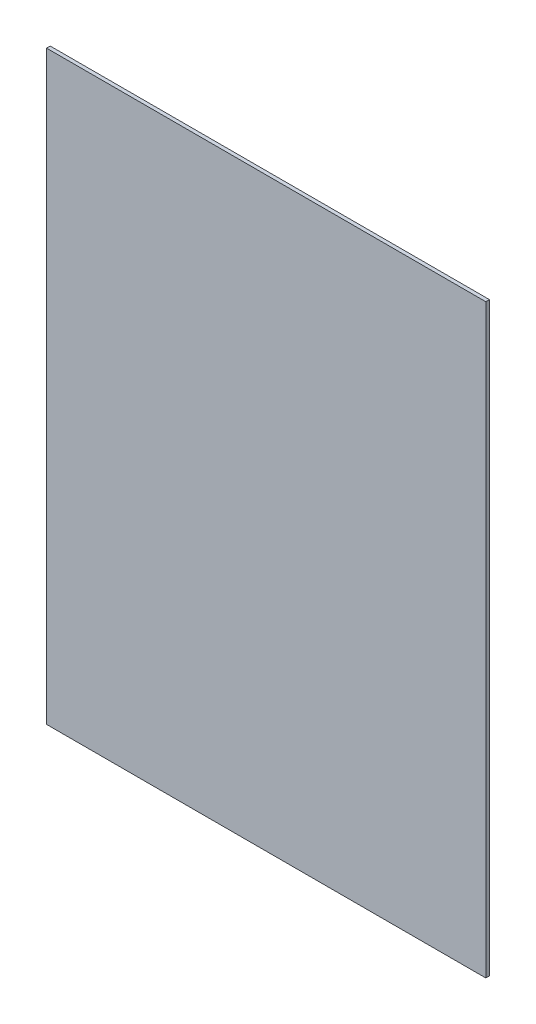
ISO-10303-21;
HEADER;
FILE_DESCRIPTION(('STEP AP214'),'2;1');
FILE_NAME('part.step','',(''),(''),'','','');
FILE_SCHEMA(('AUTOMOTIVE_DESIGN { 1 0 10303 214 1 1 1 1 }'));
ENDSEC;
DATA;
#1=APPLICATION_CONTEXT('core data for automotive mechanical design processes');
#2=APPLICATION_PROTOCOL_DEFINITION('international standard','automotive_design',2000,#1);
#3=PRODUCT_CONTEXT('',#1,'mechanical');
#4=PRODUCT('Part','Part','',(#3));
#5=PRODUCT_RELATED_PRODUCT_CATEGORY('part','',(#4));
#6=PRODUCT_DEFINITION_FORMATION('','',#4);
#7=PRODUCT_DEFINITION_CONTEXT('part definition',#1,'design');
#8=PRODUCT_DEFINITION('design','',#6,#7);
#9=PRODUCT_DEFINITION_SHAPE('','',#8);
#10=(LENGTH_UNIT() NAMED_UNIT(*) SI_UNIT(.MILLI.,.METRE.));
#11=(NAMED_UNIT(*) PLANE_ANGLE_UNIT() SI_UNIT($,.RADIAN.));
#12=(NAMED_UNIT(*) SI_UNIT($,.STERADIAN.) SOLID_ANGLE_UNIT());
#13=UNCERTAINTY_MEASURE_WITH_UNIT(LENGTH_MEASURE(1.E-05),#10,'distance_accuracy_value','');
#14=(GEOMETRIC_REPRESENTATION_CONTEXT(3) GLOBAL_UNCERTAINTY_ASSIGNED_CONTEXT((#13)) GLOBAL_UNIT_ASSIGNED_CONTEXT((#10,
#11,#12)) REPRESENTATION_CONTEXT('',''));
#15=CARTESIAN_POINT('',(0.,0.,0.));
#16=DIRECTION('',(0.,0.,1.));
#17=DIRECTION('',(1.,0.,0.));
#18=AXIS2_PLACEMENT_3D('',#15,#16,#17);
#19=CARTESIAN_POINT('',(300.,400.,5.));
#20=DIRECTION('',(-1.,0.,0.));
#21=DIRECTION('',(0.,-1.,0.));
#22=AXIS2_PLACEMENT_3D('',#19,#20,#21);
#23=PLANE('',#22);
#24=DIRECTION('',(0.,1.,0.));
#25=VECTOR('',#24,1.);
#26=CARTESIAN_POINT('',(300.,400.,0.));
#27=LINE('',#26,#25);
#28=CARTESIAN_POINT('',(300.,-400.,0.));
#29=VERTEX_POINT('',#28);
#30=CARTESIAN_POINT('',(300.,400.,0.));
#31=VERTEX_POINT('',#30);
#32=EDGE_CURVE('E96',#29,#31,#27,.T.);
#33=ORIENTED_EDGE('',*,*,#32,.T.);
#34=DIRECTION('',(0.,0.,-1.));
#35=VECTOR('',#34,1.);
#36=CARTESIAN_POINT('',(300.,400.,5.));
#37=LINE('',#36,#35);
#38=CARTESIAN_POINT('',(300.,400.,5.));
#39=VERTEX_POINT('',#38);
#40=EDGE_CURVE('E11',#39,#31,#37,.T.);
#41=ORIENTED_EDGE('',*,*,#40,.F.);
#42=DIRECTION('',(0.,1.,0.));
#43=VECTOR('',#42,1.);
#44=CARTESIAN_POINT('',(300.,400.,5.));
#45=LINE('',#44,#43);
#46=CARTESIAN_POINT('',(300.,-400.,5.));
#47=VERTEX_POINT('',#46);
#48=EDGE_CURVE('E84',#47,#39,#45,.T.);
#49=ORIENTED_EDGE('',*,*,#48,.F.);
#50=DIRECTION('',(0.,0.,-1.));
#51=VECTOR('',#50,1.);
#52=CARTESIAN_POINT('',(300.,-400.,5.));
#53=LINE('',#52,#51);
#54=EDGE_CURVE('E92',#47,#29,#53,.T.);
#55=ORIENTED_EDGE('',*,*,#54,.T.);
#56=EDGE_LOOP('',(#33,#41,#49,#55));
#57=FACE_BOUND('',#56,.T.);
#58=ADVANCED_FACE('F33',(#57),#23,.F.);
#59=CARTESIAN_POINT('',(-300.,400.,5.));
#60=DIRECTION('',(0.,-1.,0.));
#61=DIRECTION('',(0.,0.,-1.));
#62=AXIS2_PLACEMENT_3D('',#59,#60,#61);
#63=PLANE('',#62);
#64=DIRECTION('',(-1.,0.,0.));
#65=VECTOR('',#64,1.);
#66=CARTESIAN_POINT('',(-300.,400.,0.));
#67=LINE('',#66,#65);
#68=CARTESIAN_POINT('',(-300.,400.,0.));
#69=VERTEX_POINT('',#68);
#70=EDGE_CURVE('E88',#31,#69,#67,.T.);
#71=ORIENTED_EDGE('',*,*,#70,.T.);
#72=DIRECTION('',(0.,0.,-1.));
#73=VECTOR('',#72,1.);
#74=CARTESIAN_POINT('',(-300.,400.,5.));
#75=LINE('',#74,#73);
#76=CARTESIAN_POINT('',(-300.,400.,5.));
#77=VERTEX_POINT('',#76);
#78=EDGE_CURVE('E41',#77,#69,#75,.T.);
#79=ORIENTED_EDGE('',*,*,#78,.F.);
#80=DIRECTION('',(-1.,0.,0.));
#81=VECTOR('',#80,1.);
#82=CARTESIAN_POINT('',(-300.,400.,5.));
#83=LINE('',#82,#81);
#84=EDGE_CURVE('E79',#39,#77,#83,.T.);
#85=ORIENTED_EDGE('',*,*,#84,.F.);
#86=ORIENTED_EDGE('',*,*,#40,.T.);
#87=EDGE_LOOP('',(#71,#79,#85,#86));
#88=FACE_BOUND('',#87,.T.);
#89=ADVANCED_FACE('F87',(#88),#63,.F.);
#90=CARTESIAN_POINT('',(-300.,400.,5.));
#91=DIRECTION('',(1.,0.,0.));
#92=DIRECTION('',(0.,1.,0.));
#93=AXIS2_PLACEMENT_3D('',#90,#91,#92);
#94=PLANE('',#93);
#95=DIRECTION('',(0.,-1.,0.));
#96=VECTOR('',#95,1.);
#97=CARTESIAN_POINT('',(-300.,400.,0.));
#98=LINE('',#97,#96);
#99=CARTESIAN_POINT('',(-300.,-400.,0.));
#100=VERTEX_POINT('',#99);
#101=EDGE_CURVE('E66',#69,#100,#98,.T.);
#102=ORIENTED_EDGE('',*,*,#101,.T.);
#103=DIRECTION('',(0.,0.,-1.));
#104=VECTOR('',#103,1.);
#105=CARTESIAN_POINT('',(-300.,-400.,5.));
#106=LINE('',#105,#104);
#107=CARTESIAN_POINT('',(-300.,-400.,5.));
#108=VERTEX_POINT('',#107);
#109=EDGE_CURVE('E89',#108,#100,#106,.T.);
#110=ORIENTED_EDGE('',*,*,#109,.F.);
#111=DIRECTION('',(0.,-1.,0.));
#112=VECTOR('',#111,1.);
#113=CARTESIAN_POINT('',(-300.,400.,5.));
#114=LINE('',#113,#112);
#115=EDGE_CURVE('E82',#77,#108,#114,.T.);
#116=ORIENTED_EDGE('',*,*,#115,.F.);
#117=ORIENTED_EDGE('',*,*,#78,.T.);
#118=EDGE_LOOP('',(#102,#110,#116,#117));
#119=FACE_BOUND('',#118,.T.);
#120=ADVANCED_FACE('F90',(#119),#94,.F.);
#121=CARTESIAN_POINT('',(-300.,-400.,5.));
#122=DIRECTION('',(0.,1.,0.));
#123=DIRECTION('',(0.,0.,1.));
#124=AXIS2_PLACEMENT_3D('',#121,#122,#123);
#125=PLANE('',#124);
#126=DIRECTION('',(1.,0.,0.));
#127=VECTOR('',#126,1.);
#128=CARTESIAN_POINT('',(-300.,-400.,0.));
#129=LINE('',#128,#127);
#130=EDGE_CURVE('E72',#100,#29,#129,.T.);
#131=ORIENTED_EDGE('',*,*,#130,.T.);
#132=ORIENTED_EDGE('',*,*,#54,.F.);
#133=DIRECTION('',(1.,0.,0.));
#134=VECTOR('',#133,1.);
#135=CARTESIAN_POINT('',(-300.,-400.,5.));
#136=LINE('',#135,#134);
#137=EDGE_CURVE('E49',#108,#47,#136,.T.);
#138=ORIENTED_EDGE('',*,*,#137,.F.);
#139=ORIENTED_EDGE('',*,*,#109,.T.);
#140=EDGE_LOOP('',(#131,#132,#138,#139));
#141=FACE_BOUND('',#140,.T.);
#142=ADVANCED_FACE('F103',(#141),#125,.F.);
#143=CARTESIAN_POINT('',(0.,0.,5.));
#144=DIRECTION('',(0.,0.,1.));
#145=DIRECTION('',(1.,0.,0.));
#146=AXIS2_PLACEMENT_3D('',#143,#144,#145);
#147=PLANE('',#146);
#148=ORIENTED_EDGE('',*,*,#48,.T.);
#149=ORIENTED_EDGE('',*,*,#84,.T.);
#150=ORIENTED_EDGE('',*,*,#115,.T.);
#151=ORIENTED_EDGE('',*,*,#137,.T.);
#152=EDGE_LOOP('',(#148,#149,#150,#151));
#153=FACE_BOUND('',#152,.T.);
#154=ADVANCED_FACE('F80',(#153),#147,.T.);
#155=CARTESIAN_POINT('',(0.,0.,0.));
#156=DIRECTION('',(0.,0.,1.));
#157=DIRECTION('',(1.,0.,0.));
#158=AXIS2_PLACEMENT_3D('',#155,#156,#157);
#159=PLANE('',#158);
#160=ORIENTED_EDGE('',*,*,#32,.F.);
#161=ORIENTED_EDGE('',*,*,#130,.F.);
#162=ORIENTED_EDGE('',*,*,#101,.F.);
#163=ORIENTED_EDGE('',*,*,#70,.F.);
#164=EDGE_LOOP('',(#160,#161,#162,#163));
#165=FACE_BOUND('',#164,.T.);
#166=ADVANCED_FACE('F106',(#165),#159,.F.);
#167=CLOSED_SHELL('',(#58,#89,#120,#142,#154,#166));
#168=MANIFOLD_SOLID_BREP('B2',#167);
#169=ADVANCED_BREP_SHAPE_REPRESENTATION('',(#18,#168),#14);
#170=SHAPE_DEFINITION_REPRESENTATION(#9,#169);
ENDSEC;
END-ISO-10303-21;
